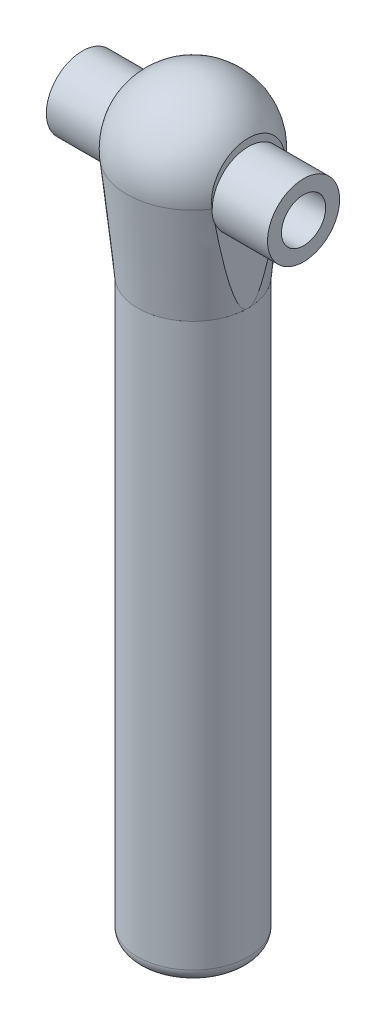
ISO-10303-21;
HEADER;
FILE_DESCRIPTION(('STEP AP214'),'2;1');
FILE_NAME('part.step','',(''),(''),'','','');
FILE_SCHEMA(('AUTOMOTIVE_DESIGN { 1 0 10303 214 1 1 1 1 }'));
ENDSEC;
DATA;
#1=APPLICATION_CONTEXT('core data for automotive mechanical design processes');
#2=APPLICATION_PROTOCOL_DEFINITION('international standard','automotive_design',2000,#1);
#3=PRODUCT_CONTEXT('',#1,'mechanical');
#4=PRODUCT('Part','Part','',(#3));
#5=PRODUCT_RELATED_PRODUCT_CATEGORY('part','',(#4));
#6=PRODUCT_DEFINITION_FORMATION('','',#4);
#7=PRODUCT_DEFINITION_CONTEXT('part definition',#1,'design');
#8=PRODUCT_DEFINITION('design','',#6,#7);
#9=PRODUCT_DEFINITION_SHAPE('','',#8);
#10=(LENGTH_UNIT() NAMED_UNIT(*) SI_UNIT(.MILLI.,.METRE.));
#11=(NAMED_UNIT(*) PLANE_ANGLE_UNIT() SI_UNIT($,.RADIAN.));
#12=(NAMED_UNIT(*) SI_UNIT($,.STERADIAN.) SOLID_ANGLE_UNIT());
#13=UNCERTAINTY_MEASURE_WITH_UNIT(LENGTH_MEASURE(1.E-05),#10,'distance_accuracy_value','');
#14=(GEOMETRIC_REPRESENTATION_CONTEXT(3) GLOBAL_UNCERTAINTY_ASSIGNED_CONTEXT((#13)) GLOBAL_UNIT_ASSIGNED_CONTEXT((#10,
#11,#12)) REPRESENTATION_CONTEXT('',''));
#15=CARTESIAN_POINT('',(0.,0.,0.));
#16=DIRECTION('',(0.,0.,1.));
#17=DIRECTION('',(1.,0.,0.));
#18=AXIS2_PLACEMENT_3D('',#15,#16,#17);
#19=CARTESIAN_POINT('',(12.5,170.,15.));
#20=DIRECTION('',(-1.,0.,0.));
#21=DIRECTION('',(0.,0.,1.));
#22=AXIS2_PLACEMENT_3D('',#19,#20,#21);
#23=PLANE('',#22);
#24=CARTESIAN_POINT('',(12.5,155.,0.));
#25=DIRECTION('',(-1.,0.,0.));
#26=DIRECTION('',(0.,0.,1.));
#27=AXIS2_PLACEMENT_3D('',#24,#25,#26);
#28=CIRCLE('',#27,8.29156197588853);
#29=CARTESIAN_POINT('',(12.5,153.460388679234,-8.14736748778213));
#30=VERTEX_POINT('',#29);
#31=CARTESIAN_POINT('',(12.5,153.460388679234,8.14736748778213));
#32=VERTEX_POINT('',#31);
#33=EDGE_CURVE('E156',#30,#32,#28,.F.);
#34=ORIENTED_EDGE('',*,*,#33,.T.);
#35=CARTESIAN_POINT('',(12.5,153.460388679234,0.));
#36=DIRECTION('',(-1.,0.,0.));
#37=DIRECTION('',(0.,0.,1.));
#38=AXIS2_PLACEMENT_3D('',#35,#36,#37);
#39=CIRCLE('',#38,8.14736748778213);
#40=EDGE_CURVE('E157',#32,#30,#39,.T.);
#41=ORIENTED_EDGE('',*,*,#40,.T.);
#42=EDGE_LOOP('',(#34,#41));
#43=FACE_BOUND('',#42,.T.);
#44=ADVANCED_FACE('F51',(#43),#23,.F.);
#45=CARTESIAN_POINT('',(-12.5,170.,15.));
#46=DIRECTION('',(1.,0.,0.));
#47=DIRECTION('',(0.,0.,-1.));
#48=AXIS2_PLACEMENT_3D('',#45,#46,#47);
#49=PLANE('',#48);
#50=CARTESIAN_POINT('',(-12.5,155.,0.));
#51=DIRECTION('',(1.,0.,0.));
#52=DIRECTION('',(0.,0.,-1.));
#53=AXIS2_PLACEMENT_3D('',#50,#51,#52);
#54=CIRCLE('',#53,8.29156197588853);
#55=CARTESIAN_POINT('',(-12.5,153.460388679234,8.14736748778213));
#56=VERTEX_POINT('',#55);
#57=CARTESIAN_POINT('',(-12.5,153.460388679234,-8.14736748778213));
#58=VERTEX_POINT('',#57);
#59=EDGE_CURVE('E161',#56,#58,#54,.F.);
#60=ORIENTED_EDGE('',*,*,#59,.T.);
#61=CARTESIAN_POINT('',(-12.5,153.460388679234,0.));
#62=DIRECTION('',(1.,0.,0.));
#63=DIRECTION('',(0.,0.,-1.));
#64=AXIS2_PLACEMENT_3D('',#61,#62,#63);
#65=CIRCLE('',#64,8.14736748778213);
#66=EDGE_CURVE('E12',#58,#56,#65,.T.);
#67=ORIENTED_EDGE('',*,*,#66,.T.);
#68=EDGE_LOOP('',(#60,#67));
#69=FACE_BOUND('',#68,.T.);
#70=ADVANCED_FACE('F135',(#69),#49,.F.);
#71=CARTESIAN_POINT('',(0.,130.,0.));
#72=DIRECTION('',(0.,1.,0.));
#73=DIRECTION('',(0.,0.,1.));
#74=AXIS2_PLACEMENT_3D('',#71,#72,#73);
#75=CONICAL_SURFACE('',#74,12.5,0.10282183670153);
#76=CARTESIAN_POINT('',(0.,153.460388679234,0.));
#77=DIRECTION('',(0.,1.,0.));
#78=DIRECTION('',(0.,0.,1.));
#79=AXIS2_PLACEMENT_3D('',#76,#77,#78);
#80=CIRCLE('',#79,14.9207773584679);
#81=EDGE_CURVE('E108',#56,#32,#80,.T.);
#82=ORIENTED_EDGE('',*,*,#81,.F.);
#83=CARTESIAN_POINT('',(-12.8971128059561,155.444131179417,7.90217455349705));
#84=CARTESIAN_POINT('',(-12.8532976993089,155.284756480767,7.94219202890737));
#85=CARTESIAN_POINT('',(-12.811769371085,155.123547450824,7.97752755589714));
#86=CARTESIAN_POINT('',(-12.73389247646,154.798021652102,8.03851555139952));
#87=CARTESIAN_POINT('',(-12.6975456348444,154.633703869018,8.06416480025946));
#88=CARTESIAN_POINT('',(-12.630574945706,154.302168273729,8.10549138551638));
#89=CARTESIAN_POINT('',(-12.5999672780091,154.134943673045,8.12114082054811));
#90=CARTESIAN_POINT('',(-12.5451212778283,153.798818876321,8.14207684777293));
#91=CARTESIAN_POINT('',(-12.5208825520526,153.629918784414,8.14736407997798));
#92=CARTESIAN_POINT('',(-12.4760668157002,153.266092738545,8.14737139677965));
#93=CARTESIAN_POINT('',(-12.4565693915909,153.071029469372,8.14040420835782));
#94=CARTESIAN_POINT('',(-12.4268283517072,152.681167967036,8.11237428924915));
#95=CARTESIAN_POINT('',(-12.4165867710369,152.486369801557,8.09130846043236));
#96=CARTESIAN_POINT('',(-12.4053744426827,152.099026556307,8.03520336730302));
#97=CARTESIAN_POINT('',(-12.4043807085105,151.906477078909,8.00019897494792));
#98=CARTESIAN_POINT('',(-12.4112699477363,151.52462811659,7.91647706410705));
#99=CARTESIAN_POINT('',(-12.4191489268737,151.335327208183,7.86776572352884));
#100=CARTESIAN_POINT('',(-12.4391519137908,151.023330661649,7.77543188887209));
#101=CARTESIAN_POINT('',(-12.4489991749449,150.89938099755,7.73548602125756));
#102=CARTESIAN_POINT('',(-12.47210814997,150.653845211785,7.64982458935827));
#103=CARTESIAN_POINT('',(-12.4853692630835,150.532258678309,7.60411004094644));
#104=CARTESIAN_POINT('',(-12.5263754528188,150.199703165639,7.46993280624241));
#105=CARTESIAN_POINT('',(-12.5574403388809,149.991506895738,7.37551962820136));
#106=CARTESIAN_POINT('',(-12.6275865101273,149.584739887028,7.17014153344888));
#107=CARTESIAN_POINT('',(-12.6666735506994,149.386176186137,7.05916474907889));
#108=CARTESIAN_POINT('',(-12.7510956333686,148.999287394967,6.82128218450927));
#109=CARTESIAN_POINT('',(-12.7964510651342,148.810998634432,6.6943245475887));
#110=CARTESIAN_POINT('',(-12.8913853980119,148.446311093265,6.42572809414165));
#111=CARTESIAN_POINT('',(-12.9409659185186,148.269916918418,6.28408364389459));
#112=CARTESIAN_POINT('',(-13.0751619933712,147.82033698982,5.8912659953042));
#113=CARTESIAN_POINT('',(-13.1617978391496,147.55788145129,5.62824934872198));
#114=CARTESIAN_POINT('',(-13.2902647410835,147.19358404562,5.20968338206092));
#115=CARTESIAN_POINT('',(-13.3327278660564,147.077320716754,5.0665682562876));
#116=CARTESIAN_POINT('',(-13.4163970094995,146.854593119621,4.77252785634636));
#117=CARTESIAN_POINT('',(-13.4576028646326,146.748130120963,4.62160157420809));
#118=CARTESIAN_POINT('',(-13.4977536066289,146.646742234709,4.46696979058302));
#119=B_SPLINE_CURVE_WITH_KNOTS('',3,(#83,#84,#85,#86,#87,#88,#89,#90,#91,#92,#93,#94,#95,#96,
#97,#98,#99,#100,#101,#102,#103,#104,#105,#106,#107,#108,#109,#110,#111,#112,#113,#114,#115,
#116,#117,#118),.UNSPECIFIED.,.F.,.F.,(4,2,2,2,2,2,2,2,2,2,2,2,2,2,2,2,2,4),(0.,
0.510141878539258,1.02045317581565,1.5321821910292,2.04387959877332,2.63162546098291,
3.21950052084173,3.8059139643774,4.39206352559995,4.78367672193357,5.17522105061486,
5.8662757270998,6.55782793561031,7.25168500598071,7.94580922487046,9.08645381551305,
9.65375599600966,10.221131565959),.UNSPECIFIED.);
#120=CARTESIAN_POINT('',(-12.5,150.413606031683,7.55623666116617));
#121=VERTEX_POINT('',#120);
#122=EDGE_CURVE('E97',#56,#121,#119,.T.);
#123=ORIENTED_EDGE('',*,*,#122,.T.);
#124=CARTESIAN_POINT('',(-12.5,191.41988562879,14.0928093796293));
#125=CARTESIAN_POINT('',(-12.5,190.007389890005,13.8979698618865));
#126=CARTESIAN_POINT('',(-12.5,188.595128519994,13.7014191869882));
#127=CARTESIAN_POINT('',(-12.5,185.771157283329,13.3043451226791));
#128=CARTESIAN_POINT('',(-12.5,184.359447419529,13.1038217129749));
#129=CARTESIAN_POINT('',(-12.5,181.536396287306,12.6982135132682));
#130=CARTESIAN_POINT('',(-12.5,180.12505514764,12.4931278258921));
#131=CARTESIAN_POINT('',(-12.5,177.303144490784,12.0777254584575));
#132=CARTESIAN_POINT('',(-12.5,175.892574972247,11.8674087875622));
#133=CARTESIAN_POINT('',(-12.5,173.076559285859,11.4413019417788));
#134=CARTESIAN_POINT('',(-12.5,171.671110372926,11.225529937595));
#135=CARTESIAN_POINT('',(-12.5,168.861335059801,10.7868013079885));
#136=CARTESIAN_POINT('',(-12.5,167.457008657467,10.5638446963158));
#137=CARTESIAN_POINT('',(-12.5,164.649905082774,10.1093227316138));
#138=CARTESIAN_POINT('',(-12.5,163.24712775627,9.87775833328004));
#139=CARTESIAN_POINT('',(-12.5,160.443367875858,9.40404784412823));
#140=CARTESIAN_POINT('',(-12.5,159.042385308225,9.16190183472984));
#141=CARTESIAN_POINT('',(-12.5,156.24202286729,8.66420633700024));
#142=CARTESIAN_POINT('',(-12.5,154.842644231345,8.40864983674422));
#143=CARTESIAN_POINT('',(-12.5,152.745908217305,8.01231278651157));
#144=CARTESIAN_POINT('',(-12.5,152.047323477552,7.87802099266218));
#145=CARTESIAN_POINT('',(-12.5,150.651142785268,7.60439920271956));
#146=CARTESIAN_POINT('',(-12.5,149.953546827519,7.46506923332402));
#147=CARTESIAN_POINT('',(-12.5,148.557486802977,7.18008213292745));
#148=CARTESIAN_POINT('',(-12.5,147.859026313502,7.03440743561615));
#149=CARTESIAN_POINT('',(-12.5,146.463624755377,6.73597303804361));
#150=CARTESIAN_POINT('',(-12.5,145.766683669069,6.5832134205816));
#151=CARTESIAN_POINT('',(-12.5,144.375013963069,6.26913875840751));
#152=CARTESIAN_POINT('',(-12.5,143.680284574083,6.1078271383986));
#153=CARTESIAN_POINT('',(-12.5,142.293426107252,5.77446388083123));
#154=CARTESIAN_POINT('',(-12.5,141.601296931447,5.6024126522617));
#155=CARTESIAN_POINT('',(-12.5,140.21827213756,5.24390099237299));
#156=CARTESIAN_POINT('',(-12.5,139.527388335694,5.05739441024336));
#157=CARTESIAN_POINT('',(-12.5,138.494756152031,4.7634053076002));
#158=CARTESIAN_POINT('',(-12.5,138.150996798182,4.66298574858849));
#159=CARTESIAN_POINT('',(-12.5,137.465188977526,4.456492455788));
#160=CARTESIAN_POINT('',(-12.5,137.123140436881,4.35041896836576));
#161=CARTESIAN_POINT('',(-12.5,136.442275511826,4.13174991242631));
#162=CARTESIAN_POINT('',(-12.5,136.103452453097,4.01917521143061));
#163=CARTESIAN_POINT('',(-12.5,135.428742156675,3.78556031249038));
#164=CARTESIAN_POINT('',(-12.5,135.09285470439,3.66452073924293));
#165=CARTESIAN_POINT('',(-12.5,134.425670953151,3.41174036555002));
#166=CARTESIAN_POINT('',(-12.5,134.094368651637,3.28001549424377));
#167=CARTESIAN_POINT('',(-12.5,133.437920871125,3.00212731813082));
#168=CARTESIAN_POINT('',(-12.5,133.112772573138,2.8559708246667));
#169=CARTESIAN_POINT('',(-12.5,132.631816927456,2.62082548058945));
#170=CARTESIAN_POINT('',(-12.5,132.472237428326,2.53956964937583));
#171=CARTESIAN_POINT('',(-12.5,132.156446630354,2.37050394950973));
#172=CARTESIAN_POINT('',(-12.5,132.000237173263,2.28269060850811));
#173=CARTESIAN_POINT('',(-12.5,131.692573780173,2.09880063653451));
#174=CARTESIAN_POINT('',(-12.5,131.54112306518,2.0027185665348));
#175=CARTESIAN_POINT('',(-12.5,131.245587196824,1.7999280184929));
#176=CARTESIAN_POINT('',(-12.5,131.101494472482,1.69323081043086));
#177=CARTESIAN_POINT('',(-12.5,130.823339890126,1.46433533138545));
#178=CARTESIAN_POINT('',(-12.5,130.689406140449,1.34197912683608));
#179=CARTESIAN_POINT('',(-12.5,130.442716774831,1.07764770934364));
#180=CARTESIAN_POINT('',(-12.5,130.329822705351,0.935812262252842));
#181=CARTESIAN_POINT('',(-12.5,130.194096011985,0.711326523015938));
#182=CARTESIAN_POINT('',(-12.5,130.155616438178,0.638270287037325));
#183=CARTESIAN_POINT('',(-12.5,130.089792972909,0.487242362308563));
#184=CARTESIAN_POINT('',(-12.5,130.062439516739,0.409274962385271));
#185=CARTESIAN_POINT('',(-12.5,130.021484702966,0.248801196290968));
#186=CARTESIAN_POINT('',(-12.5,130.008033042449,0.166255306340109));
#187=CARTESIAN_POINT('',(-12.5,129.997332225669,0.000121635418316699));
#188=CARTESIAN_POINT('',(-12.5,130.000073193944,-0.083465479499697));
#189=CARTESIAN_POINT('',(-12.5,130.020128179634,-0.239495032837292));
#190=CARTESIAN_POINT('',(-12.5,130.035817907575,-0.3121576170559));
#191=CARTESIAN_POINT('',(-12.5,130.078003812939,-0.454247515189188));
#192=CARTESIAN_POINT('',(-12.5,130.104508230407,-0.523672317093025));
#193=CARTESIAN_POINT('',(-12.5,130.18468307797,-0.698845501695901));
#194=CARTESIAN_POINT('',(-12.5,130.245118563872,-0.801466855690371));
#195=CARTESIAN_POINT('',(-12.5,130.380648537201,-0.996499074099693));
#196=CARTESIAN_POINT('',(-12.5,130.455789704793,-1.08887591686963));
#197=CARTESIAN_POINT('',(-12.5,130.636015681202,-1.28728330089285));
#198=CARTESIAN_POINT('',(-12.5,130.743847604067,-1.39077892483156));
#199=CARTESIAN_POINT('',(-12.5,130.96891781461,-1.58712000862766));
#200=CARTESIAN_POINT('',(-12.5,131.086173988613,-1.67994436377089));
#201=CARTESIAN_POINT('',(-12.5,131.327478386487,-1.85767524598175));
#202=CARTESIAN_POINT('',(-12.5,131.451560634086,-1.94253506822734));
#203=CARTESIAN_POINT('',(-12.5,131.703912012093,-2.10542773582022));
#204=CARTESIAN_POINT('',(-12.5,131.832177088996,-2.18346693590289));
#205=CARTESIAN_POINT('',(-12.5,132.213477097929,-2.40477077191927));
#206=CARTESIAN_POINT('',(-12.5,132.470797084058,-2.5406275556516));
#207=CARTESIAN_POINT('',(-12.5,132.992430702121,-2.79829984280627));
#208=CARTESIAN_POINT('',(-12.5,133.256749276505,-2.92010507916519));
#209=CARTESIAN_POINT('',(-12.5,133.790570075184,-3.15343876604214));
#210=CARTESIAN_POINT('',(-12.5,134.06008268776,-3.26494330571197));
#211=CARTESIAN_POINT('',(-12.5,134.602360315166,-3.47975658322876));
#212=CARTESIAN_POINT('',(-12.5,134.875125685206,-3.58306441637092));
#213=CARTESIAN_POINT('',(-12.5,135.42352370356,-3.78327515659855));
#214=CARTESIAN_POINT('',(-12.5,135.699160515459,-3.88016660511753));
#215=CARTESIAN_POINT('',(-12.5,136.252292314313,-4.06853140319062));
#216=CARTESIAN_POINT('',(-12.5,136.529787427041,-4.1600043818005));
#217=CARTESIAN_POINT('',(-12.5,137.085804687615,-4.33826504469676));
#218=CARTESIAN_POINT('',(-12.5,137.364324606585,-4.42505970194713));
#219=CARTESIAN_POINT('',(-12.5,137.922529475745,-4.59477427182586));
#220=CARTESIAN_POINT('',(-12.5,138.202214390715,-4.67769430067802));
#221=CARTESIAN_POINT('',(-12.5,139.036413660791,-4.91963197320274));
#222=CARTESIAN_POINT('',(-12.5,139.592334321923,-5.07380481304442));
#223=CARTESIAN_POINT('',(-12.5,140.706877674334,-5.37209173831357));
#224=CARTESIAN_POINT('',(-12.5,141.265500521076,-5.5162052374623));
#225=CARTESIAN_POINT('',(-12.5,142.384869773969,-5.79637606514947));
#226=CARTESIAN_POINT('',(-12.5,142.945616563404,-5.93243185791832));
#227=CARTESIAN_POINT('',(-12.5,144.068686977119,-6.19788707016519));
#228=CARTESIAN_POINT('',(-12.5,144.631010628656,-6.32728637382525));
#229=CARTESIAN_POINT('',(-12.5,146.321213650886,-6.70747106652309));
#230=CARTESIAN_POINT('',(-12.5,147.450970553561,-6.94991037339827));
#231=CARTESIAN_POINT('',(-12.5,149.713706014729,-7.41843680466489));
#232=CARTESIAN_POINT('',(-12.5,150.846684212188,-7.64452569188175));
#233=CARTESIAN_POINT('',(-12.5,153.112606873497,-8.08358983876333));
#234=CARTESIAN_POINT('',(-12.5,154.245546020163,-8.29659262738472));
#235=CARTESIAN_POINT('',(-12.5,156.513286755815,-8.71257208111089));
#236=CARTESIAN_POINT('',(-12.5,157.648088393098,-8.9155484818283));
#237=CARTESIAN_POINT('',(-12.5,159.918481067632,-9.31318172123117));
#238=CARTESIAN_POINT('',(-12.5,161.054071291348,-9.5078432162104));
#239=CARTESIAN_POINT('',(-12.5,163.326405705193,-9.89031974033313));
#240=CARTESIAN_POINT('',(-12.5,164.463149899842,-10.0781347425492));
#241=CARTESIAN_POINT('',(-12.5,167.747347989097,-10.6121964801569));
#242=CARTESIAN_POINT('',(-12.5,169.896005669125,-10.951041733623));
#243=CARTESIAN_POINT('',(-12.5,174.19609444908,-11.6132528452771));
#244=CARTESIAN_POINT('',(-12.5,176.347525986807,-11.9366158419256));
#245=CARTESIAN_POINT('',(-12.5,180.651880543901,-12.5710749496353));
#246=CARTESIAN_POINT('',(-12.5,182.804803306861,-12.8821728032254));
#247=CARTESIAN_POINT('',(-12.5,186.03500929569,-13.3414035057081));
#248=CARTESIAN_POINT('',(-12.5,187.111769906666,-13.4932290349799));
#249=CARTESIAN_POINT('',(-12.5,189.265602510448,-13.794642029263));
#250=CARTESIAN_POINT('',(-12.5,190.342674502714,-13.9442294981417));
#251=CARTESIAN_POINT('',(-12.5,191.41988562879,-14.0928093796293));
#252=B_SPLINE_CURVE_WITH_KNOTS('',3,(#124,#125,#126,#127,#128,#129,#130,#131,#132,#133,#134,
#135,#136,#137,#138,#139,#140,#141,#142,#143,#144,#145,#146,#147,#148,#149,#150,#151,#152,#153,
#154,#155,#156,#157,#158,#159,#160,#161,#162,#163,#164,#165,#166,#167,#168,#169,#170,#171,#172,
#173,#174,#175,#176,#177,#178,#179,#180,#181,#182,#183,#184,#185,#186,#187,#188,#189,#190,#191,
#192,#193,#194,#195,#196,#197,#198,#199,#200,#201,#202,#203,#204,#205,#206,#207,#208,#209,#210,
#211,#212,#213,#214,#215,#216,#217,#218,#219,#220,#221,#222,#223,#224,#225,#226,#227,#228,#229,
#230,#231,#232,#233,#234,#235,#236,#237,#238,#239,#240,#241,#242,#243,#244,#245,#246,#247,#248,
#249,#250,#251),.UNSPECIFIED.,.F.,.F.,(4,2,2,2,2,2,2,2,2,2,2,2,2,2,2,2,2,2,2,2,2,2,2,2,2,2,2,2,
2,2,2,2,2,2,2,2,2,2,2,2,2,2,2,2,2,2,2,2,2,2,2,2,2,2,2,2,2,2,2,2,2,2,2,4),(0.,4.27761287425656,
8.5552476049287,12.8337312941431,17.1122074891822,21.3779389349277,25.6436622173426,
29.9089137888982,34.1741325474852,38.4416041183244,40.57571565616,42.7098158868257,
44.8502558139237,46.9906707326768,49.1302348898165,51.2697176170933,53.4163370860661,
54.4906792901132,55.5649747185527,56.6359952804093,57.7069368855151,58.7763103299844,
59.8451814493958,60.3822979538988,60.9197009184827,61.4574601196538,61.994654359735,
62.537771307661,63.077177230072,63.3241894277115,63.5709888271232,63.8204189598785,
64.0696969873908,64.2917501172128,64.5139727530523,64.8691888502152,65.2255513520595,
65.6728906524752,66.1210999719161,66.5717919264221,67.0220593950373,67.8942724215533,
68.7671187658195,69.6419428357274,70.5168633296939,71.3933063431609,72.2698092880544,
73.1449674838723,74.0200994114713,75.7506688962985,77.4813391581497,79.2123382248812,
80.9433673995287,84.4096094190891,87.875477165847,91.3337848302683,94.7921836387049,
98.2486196723698,101.705069298836,108.23061857107,114.757369321756,121.283189440141,
124.545423042593,127.807651007308),.UNSPECIFIED.);
#253=CARTESIAN_POINT('',(-12.5,130.,0.));
#254=VERTEX_POINT('',#253);
#255=EDGE_CURVE('E102',#121,#254,#252,.T.);
#256=ORIENTED_EDGE('',*,*,#255,.T.);
#257=CARTESIAN_POINT('',(0.,130.,0.));
#258=DIRECTION('',(0.,1.,0.));
#259=DIRECTION('',(0.,0.,1.));
#260=AXIS2_PLACEMENT_3D('',#257,#258,#259);
#261=CIRCLE('',#260,12.5);
#262=CARTESIAN_POINT('',(12.5,130.,0.));
#263=VERTEX_POINT('',#262);
#264=EDGE_CURVE('E167',#254,#263,#261,.T.);
#265=ORIENTED_EDGE('',*,*,#264,.T.);
#266=CARTESIAN_POINT('',(12.5,191.41988562879,-14.0928093796293));
#267=CARTESIAN_POINT('',(12.5,190.007389890005,-13.8979698618865));
#268=CARTESIAN_POINT('',(12.5,188.595128519994,-13.7014191869882));
#269=CARTESIAN_POINT('',(12.5,185.771157283329,-13.3043451226791));
#270=CARTESIAN_POINT('',(12.5,184.359447419529,-13.1038217129749));
#271=CARTESIAN_POINT('',(12.5,181.536396287306,-12.6982135132682));
#272=CARTESIAN_POINT('',(12.5,180.12505514764,-12.4931278258921));
#273=CARTESIAN_POINT('',(12.5,177.303144490784,-12.0777254584575));
#274=CARTESIAN_POINT('',(12.5,175.892574972247,-11.8674087875622));
#275=CARTESIAN_POINT('',(12.5,173.076559285859,-11.4413019417788));
#276=CARTESIAN_POINT('',(12.5,171.671110372926,-11.225529937595));
#277=CARTESIAN_POINT('',(12.5,168.861335059801,-10.7868013079885));
#278=CARTESIAN_POINT('',(12.5,167.457008657467,-10.5638446963158));
#279=CARTESIAN_POINT('',(12.5,164.649905082774,-10.1093227316138));
#280=CARTESIAN_POINT('',(12.5,163.24712775627,-9.87775833328004));
#281=CARTESIAN_POINT('',(12.5,160.443367875858,-9.40404784412823));
#282=CARTESIAN_POINT('',(12.5,159.042385308225,-9.16190183472984));
#283=CARTESIAN_POINT('',(12.5,156.24202286729,-8.66420633700024));
#284=CARTESIAN_POINT('',(12.5,154.842644231345,-8.40864983674422));
#285=CARTESIAN_POINT('',(12.5,152.745908217305,-8.01231278651157));
#286=CARTESIAN_POINT('',(12.5,152.047323477552,-7.87802099266218));
#287=CARTESIAN_POINT('',(12.5,150.651142785268,-7.60439920271956));
#288=CARTESIAN_POINT('',(12.5,149.953546827519,-7.46506923332402));
#289=CARTESIAN_POINT('',(12.5,148.557486802977,-7.18008213292745));
#290=CARTESIAN_POINT('',(12.5,147.859026313502,-7.03440743561615));
#291=CARTESIAN_POINT('',(12.5,146.463624755377,-6.73597303804361));
#292=CARTESIAN_POINT('',(12.5,145.766683669069,-6.5832134205816));
#293=CARTESIAN_POINT('',(12.5,144.375013963069,-6.26913875840751));
#294=CARTESIAN_POINT('',(12.5,143.680284574083,-6.1078271383986));
#295=CARTESIAN_POINT('',(12.5,142.293426107252,-5.77446388083123));
#296=CARTESIAN_POINT('',(12.5,141.601296931447,-5.6024126522617));
#297=CARTESIAN_POINT('',(12.5,140.21827213756,-5.24390099237299));
#298=CARTESIAN_POINT('',(12.5,139.527388335694,-5.05739441024336));
#299=CARTESIAN_POINT('',(12.5,138.494756152031,-4.7634053076002));
#300=CARTESIAN_POINT('',(12.5,138.150996798182,-4.66298574858849));
#301=CARTESIAN_POINT('',(12.5,137.465188977526,-4.456492455788));
#302=CARTESIAN_POINT('',(12.5,137.123140436881,-4.35041896836576));
#303=CARTESIAN_POINT('',(12.5,136.442275511826,-4.13174991242631));
#304=CARTESIAN_POINT('',(12.5,136.103452453097,-4.01917521143061));
#305=CARTESIAN_POINT('',(12.5,135.428742156675,-3.78556031249038));
#306=CARTESIAN_POINT('',(12.5,135.09285470439,-3.66452073924293));
#307=CARTESIAN_POINT('',(12.5,134.425670953151,-3.41174036555002));
#308=CARTESIAN_POINT('',(12.5,134.094368651637,-3.28001549424377));
#309=CARTESIAN_POINT('',(12.5,133.437920871125,-3.00212731813082));
#310=CARTESIAN_POINT('',(12.5,133.112772573138,-2.8559708246667));
#311=CARTESIAN_POINT('',(12.5,132.631816927456,-2.62082548058945));
#312=CARTESIAN_POINT('',(12.5,132.472237428326,-2.53956964937583));
#313=CARTESIAN_POINT('',(12.5,132.156446630354,-2.37050394950973));
#314=CARTESIAN_POINT('',(12.5,132.000237173263,-2.28269060850811));
#315=CARTESIAN_POINT('',(12.5,131.692573780173,-2.09880063653451));
#316=CARTESIAN_POINT('',(12.5,131.54112306518,-2.0027185665348));
#317=CARTESIAN_POINT('',(12.5,131.245587196824,-1.7999280184929));
#318=CARTESIAN_POINT('',(12.5,131.101494472482,-1.69323081043086));
#319=CARTESIAN_POINT('',(12.5,130.823339890126,-1.46433533138545));
#320=CARTESIAN_POINT('',(12.5,130.689406140449,-1.34197912683608));
#321=CARTESIAN_POINT('',(12.5,130.442716774831,-1.07764770934364));
#322=CARTESIAN_POINT('',(12.5,130.329822705351,-0.935812262252842));
#323=CARTESIAN_POINT('',(12.5,130.194096011985,-0.711326523015938));
#324=CARTESIAN_POINT('',(12.5,130.155616438178,-0.638270287037325));
#325=CARTESIAN_POINT('',(12.5,130.089792972909,-0.487242362308563));
#326=CARTESIAN_POINT('',(12.5,130.062439516739,-0.409274962385271));
#327=CARTESIAN_POINT('',(12.5,130.021484702966,-0.248801196290968));
#328=CARTESIAN_POINT('',(12.5,130.008033042449,-0.166255306340109));
#329=CARTESIAN_POINT('',(12.5,129.997332225669,-0.000121635418316699));
#330=CARTESIAN_POINT('',(12.5,130.000073193944,0.083465479499697));
#331=CARTESIAN_POINT('',(12.5,130.020128179634,0.239495032837292));
#332=CARTESIAN_POINT('',(12.5,130.035817907575,0.3121576170559));
#333=CARTESIAN_POINT('',(12.5,130.078003812939,0.454247515189188));
#334=CARTESIAN_POINT('',(12.5,130.104508230407,0.523672317093025));
#335=CARTESIAN_POINT('',(12.5,130.18468307797,0.698845501695901));
#336=CARTESIAN_POINT('',(12.5,130.245118563872,0.801466855690371));
#337=CARTESIAN_POINT('',(12.5,130.380648537201,0.996499074099693));
#338=CARTESIAN_POINT('',(12.5,130.455789704793,1.08887591686963));
#339=CARTESIAN_POINT('',(12.5,130.636015681202,1.28728330089285));
#340=CARTESIAN_POINT('',(12.5,130.743847604067,1.39077892483156));
#341=CARTESIAN_POINT('',(12.5,130.96891781461,1.58712000862766));
#342=CARTESIAN_POINT('',(12.5,131.086173988613,1.67994436377089));
#343=CARTESIAN_POINT('',(12.5,131.327478386487,1.85767524598175));
#344=CARTESIAN_POINT('',(12.5,131.451560634086,1.94253506822734));
#345=CARTESIAN_POINT('',(12.5,131.703912012093,2.10542773582022));
#346=CARTESIAN_POINT('',(12.5,131.832177088996,2.18346693590289));
#347=CARTESIAN_POINT('',(12.5,132.213477097929,2.40477077191927));
#348=CARTESIAN_POINT('',(12.5,132.470797084058,2.5406275556516));
#349=CARTESIAN_POINT('',(12.5,132.992430702121,2.79829984280627));
#350=CARTESIAN_POINT('',(12.5,133.256749276505,2.92010507916519));
#351=CARTESIAN_POINT('',(12.5,133.790570075184,3.15343876604214));
#352=CARTESIAN_POINT('',(12.5,134.06008268776,3.26494330571197));
#353=CARTESIAN_POINT('',(12.5,134.602360315166,3.47975658322876));
#354=CARTESIAN_POINT('',(12.5,134.875125685206,3.58306441637092));
#355=CARTESIAN_POINT('',(12.5,135.42352370356,3.78327515659855));
#356=CARTESIAN_POINT('',(12.5,135.699160515459,3.88016660511753));
#357=CARTESIAN_POINT('',(12.5,136.252292314313,4.06853140319062));
#358=CARTESIAN_POINT('',(12.5,136.529787427041,4.1600043818005));
#359=CARTESIAN_POINT('',(12.5,137.085804687615,4.33826504469676));
#360=CARTESIAN_POINT('',(12.5,137.364324606585,4.42505970194713));
#361=CARTESIAN_POINT('',(12.5,137.922529475745,4.59477427182586));
#362=CARTESIAN_POINT('',(12.5,138.202214390715,4.67769430067802));
#363=CARTESIAN_POINT('',(12.5,139.036413660791,4.91963197320274));
#364=CARTESIAN_POINT('',(12.5,139.592334321923,5.07380481304442));
#365=CARTESIAN_POINT('',(12.5,140.706877674334,5.37209173831357));
#366=CARTESIAN_POINT('',(12.5,141.265500521076,5.5162052374623));
#367=CARTESIAN_POINT('',(12.5,142.384869773969,5.79637606514947));
#368=CARTESIAN_POINT('',(12.5,142.945616563404,5.93243185791832));
#369=CARTESIAN_POINT('',(12.5,144.068686977119,6.19788707016519));
#370=CARTESIAN_POINT('',(12.5,144.631010628656,6.32728637382525));
#371=CARTESIAN_POINT('',(12.5,146.321213650886,6.70747106652309));
#372=CARTESIAN_POINT('',(12.5,147.450970553561,6.94991037339827));
#373=CARTESIAN_POINT('',(12.5,149.713706014729,7.41843680466489));
#374=CARTESIAN_POINT('',(12.5,150.846684212188,7.64452569188175));
#375=CARTESIAN_POINT('',(12.5,153.112606873497,8.08358983876333));
#376=CARTESIAN_POINT('',(12.5,154.245546020163,8.29659262738472));
#377=CARTESIAN_POINT('',(12.5,156.513286755815,8.71257208111089));
#378=CARTESIAN_POINT('',(12.5,157.648088393098,8.9155484818283));
#379=CARTESIAN_POINT('',(12.5,159.918481067632,9.31318172123117));
#380=CARTESIAN_POINT('',(12.5,161.054071291348,9.5078432162104));
#381=CARTESIAN_POINT('',(12.5,163.326405705193,9.89031974033313));
#382=CARTESIAN_POINT('',(12.5,164.463149899842,10.0781347425492));
#383=CARTESIAN_POINT('',(12.5,167.747347989097,10.6121964801569));
#384=CARTESIAN_POINT('',(12.5,169.896005669125,10.951041733623));
#385=CARTESIAN_POINT('',(12.5,174.19609444908,11.6132528452771));
#386=CARTESIAN_POINT('',(12.5,176.347525986807,11.9366158419256));
#387=CARTESIAN_POINT('',(12.5,180.651880543901,12.5710749496353));
#388=CARTESIAN_POINT('',(12.5,182.804803306861,12.8821728032254));
#389=CARTESIAN_POINT('',(12.5,186.03500929569,13.3414035057081));
#390=CARTESIAN_POINT('',(12.5,187.111769906666,13.4932290349799));
#391=CARTESIAN_POINT('',(12.5,189.265602510448,13.794642029263));
#392=CARTESIAN_POINT('',(12.5,190.342674502714,13.9442294981417));
#393=CARTESIAN_POINT('',(12.5,191.41988562879,14.0928093796293));
#394=B_SPLINE_CURVE_WITH_KNOTS('',3,(#266,#267,#268,#269,#270,#271,#272,#273,#274,#275,#276,
#277,#278,#279,#280,#281,#282,#283,#284,#285,#286,#287,#288,#289,#290,#291,#292,#293,#294,#295,
#296,#297,#298,#299,#300,#301,#302,#303,#304,#305,#306,#307,#308,#309,#310,#311,#312,#313,#314,
#315,#316,#317,#318,#319,#320,#321,#322,#323,#324,#325,#326,#327,#328,#329,#330,#331,#332,#333,
#334,#335,#336,#337,#338,#339,#340,#341,#342,#343,#344,#345,#346,#347,#348,#349,#350,#351,#352,
#353,#354,#355,#356,#357,#358,#359,#360,#361,#362,#363,#364,#365,#366,#367,#368,#369,#370,#371,
#372,#373,#374,#375,#376,#377,#378,#379,#380,#381,#382,#383,#384,#385,#386,#387,#388,#389,#390,
#391,#392,#393),.UNSPECIFIED.,.F.,.F.,(4,2,2,2,2,2,2,2,2,2,2,2,2,2,2,2,2,2,2,2,2,2,2,2,2,2,2,2,
2,2,2,2,2,2,2,2,2,2,2,2,2,2,2,2,2,2,2,2,2,2,2,2,2,2,2,2,2,2,2,2,2,2,2,4),(0.,4.27761287425656,
8.5552476049287,12.8337312941431,17.1122074891822,21.3779389349277,25.6436622173426,
29.9089137888982,34.1741325474853,38.4416041183244,40.57571565616,42.7098158868257,
44.8502558139237,46.9906707326768,49.1302348898165,51.2697176170934,53.4163370860661,
54.4906792901133,55.5649747185527,56.6359952804093,57.7069368855151,58.7763103299844,
59.8451814493958,60.3822979538988,60.9197009184827,61.4574601196539,61.994654359735,
62.537771307661,63.077177230072,63.3241894277115,63.5709888271232,63.8204189598785,
64.0696969873908,64.2917501172128,64.5139727530523,64.8691888502152,65.2255513520595,
65.6728906524752,66.1210999719161,66.5717919264221,67.0220593950373,67.8942724215533,
68.7671187658195,69.6419428357274,70.5168633296939,71.3933063431609,72.2698092880544,
73.1449674838723,74.0200994114713,75.7506688962985,77.4813391581497,79.2123382248812,
80.9433673995287,84.4096094190891,87.875477165847,91.3337848302683,94.7921836387049,
98.2486196723698,101.705069298836,108.23061857107,114.757369321756,121.283189440141,
124.545423042593,127.807651007308),.UNSPECIFIED.);
#395=CARTESIAN_POINT('',(12.5,150.413606031668,7.55623666116311));
#396=VERTEX_POINT('',#395);
#397=EDGE_CURVE('E122',#263,#396,#394,.T.);
#398=ORIENTED_EDGE('',*,*,#397,.T.);
#399=CARTESIAN_POINT('',(13.4977536066289,146.646742234709,4.46696979058302));
#400=CARTESIAN_POINT('',(13.4473513378521,146.77404481966,4.66114906131095));
#401=CARTESIAN_POINT('',(13.3952391252709,146.909428683367,4.84955255600701));
#402=CARTESIAN_POINT('',(13.28936768276,147.195540982223,5.21391906719938));
#403=CARTESIAN_POINT('',(13.2356080146444,147.346273524976,5.38987873202355));
#404=CARTESIAN_POINT('',(13.1282038518432,147.662312620564,5.72848843461279));
#405=CARTESIAN_POINT('',(13.07455947154,147.827629854629,5.89112854675162));
#406=CARTESIAN_POINT('',(12.9693814776994,148.171826078772,6.20197387775286));
#407=CARTESIAN_POINT('',(12.9178473339891,148.350701629876,6.35018273535806));
#408=CARTESIAN_POINT('',(12.7922007549883,148.821100503269,6.70705793099499));
#409=CARTESIAN_POINT('',(12.7208756722807,149.121409600784,6.90529733618149));
#410=CARTESIAN_POINT('',(12.5956555843632,149.748401916203,7.26157730782243));
#411=CARTESIAN_POINT('',(12.5417515157382,150.075071309051,7.41963876799072));
#412=CARTESIAN_POINT('',(12.4779316820096,150.592541102612,7.62843689835768));
#413=CARTESIAN_POINT('',(12.4592111532333,150.776040837074,7.69493914958879));
#414=CARTESIAN_POINT('',(12.4297714924625,151.147904923411,7.81473724743312));
#415=CARTESIAN_POINT('',(12.4190495350241,151.336267533157,7.86803775302961));
#416=CARTESIAN_POINT('',(12.4063419590935,151.7163854231,7.96092309583333));
#417=CARTESIAN_POINT('',(12.4043456494712,151.90813626231,8.00052466286769));
#418=CARTESIAN_POINT('',(12.4095006763277,152.293801319165,8.06578475209951));
#419=CARTESIAN_POINT('',(12.416647506786,152.487714424503,8.09145013360039));
#420=CARTESIAN_POINT('',(12.4362735055254,152.811737297866,8.12255231064468));
#421=CARTESIAN_POINT('',(12.4461933849636,152.941648156393,8.1318764349193));
#422=CARTESIAN_POINT('',(12.4700926265064,153.201314618321,8.14428381276629));
#423=CARTESIAN_POINT('',(12.4840694407783,153.331070267998,8.14737097361427));
#424=CARTESIAN_POINT('',(12.520807044667,153.629292646909,8.14736294166565));
#425=CARTESIAN_POINT('',(12.5449460367274,153.797594108326,8.14211470471513));
#426=CARTESIAN_POINT('',(12.5995608108569,154.132601933708,8.1213247181839));
#427=CARTESIAN_POINT('',(12.6300399401039,154.299307406271,8.10577752191667));
#428=CARTESIAN_POINT('',(12.696946999304,154.63094910005,8.0645775102013));
#429=CARTESIAN_POINT('',(12.7333981840361,154.795875605652,8.03888461333158));
#430=CARTESIAN_POINT('',(12.8115060841787,155.122526314033,7.977751577796));
#431=CARTESIAN_POINT('',(12.853158752439,155.28425289448,7.9423189918795));
#432=CARTESIAN_POINT('',(12.8971128059561,155.444131179417,7.90217455349705));
#433=B_SPLINE_CURVE_WITH_KNOTS('',3,(#399,#400,#401,#402,#403,#404,#405,#406,#407,#408,#409,
#410,#411,#412,#413,#414,#415,#416,#417,#418,#419,#420,#421,#422,#423,#424,#425,#426,#427,#428,
#429,#430,#431,#432),.UNSPECIFIED.,.F.,.F.,(4,2,2,2,2,2,2,2,2,2,2,2,2,2,2,2,4),(0.,
0.712535680451438,1.42526255295431,2.13851580058702,2.85158873800976,3.94868990639044,
5.04521937727423,5.63287223444927,6.22031740860931,6.80704261141742,7.39347876937865,
7.78514827405034,8.17657233302423,8.68642101910838,9.19653955822127,9.70869385431527,
10.2204521097021),.UNSPECIFIED.);
#434=EDGE_CURVE('E66',#396,#32,#433,.T.);
#435=ORIENTED_EDGE('',*,*,#434,.T.);
#436=EDGE_LOOP('',(#82,#123,#256,#265,#398,#435));
#437=FACE_BOUND('',#436,.T.);
#438=ADVANCED_FACE('F105',(#437),#75,.T.);
#439=CARTESIAN_POINT('',(0.,155.,0.));
#440=DIRECTION('',(0.,1.,0.));
#441=DIRECTION('',(0.,0.,1.));
#442=AXIS2_PLACEMENT_3D('',#439,#440,#441);
#443=SPHERICAL_SURFACE('',#442,15.);
#444=ORIENTED_EDGE('',*,*,#59,.F.);
#445=ORIENTED_EDGE('',*,*,#81,.T.);
#446=ORIENTED_EDGE('',*,*,#33,.F.);
#447=EDGE_CURVE('E165',#30,#58,#80,.T.);
#448=ORIENTED_EDGE('',*,*,#447,.T.);
#449=EDGE_LOOP('',(#444,#445,#446,#448));
#450=FACE_BOUND('',#449,.T.);
#451=ADVANCED_FACE('F53',(#450),#443,.T.);
#452=CARTESIAN_POINT('',(0.,130.,0.));
#453=DIRECTION('',(0.,-1.,0.));
#454=DIRECTION('',(0.,0.,-1.));
#455=AXIS2_PLACEMENT_3D('',#452,#453,#454);
#456=PLANE('',#455);
#457=EDGE_CURVE('E169',#263,#254,#261,.T.);
#458=ORIENTED_EDGE('',*,*,#457,.F.);
#459=ORIENTED_EDGE('',*,*,#264,.F.);
#460=EDGE_LOOP('',(#458,#459));
#461=FACE_BOUND('',#460,.T.);
#462=ADVANCED_FACE('F146',(#461),#456,.T.);
#463=ORIENTED_EDGE('',*,*,#447,.F.);
#464=CARTESIAN_POINT('',(12.8971128059561,155.444131179417,-7.90217455349705));
#465=CARTESIAN_POINT('',(12.8532976993089,155.284756480767,-7.94219202890737));
#466=CARTESIAN_POINT('',(12.811769371085,155.123547450824,-7.97752755589714));
#467=CARTESIAN_POINT('',(12.73389247646,154.798021652102,-8.03851555139952));
#468=CARTESIAN_POINT('',(12.6975456348444,154.633703869018,-8.06416480025946));
#469=CARTESIAN_POINT('',(12.630574945706,154.302168273729,-8.10549138551638));
#470=CARTESIAN_POINT('',(12.5999672780091,154.134943673045,-8.12114082054811));
#471=CARTESIAN_POINT('',(12.5451212778283,153.798818876321,-8.14207684777293));
#472=CARTESIAN_POINT('',(12.5208825520526,153.629918784414,-8.14736407997798));
#473=CARTESIAN_POINT('',(12.4760668157002,153.266092738545,-8.14737139677965));
#474=CARTESIAN_POINT('',(12.4565693915909,153.071029469372,-8.14040420835782));
#475=CARTESIAN_POINT('',(12.4268283517072,152.681167967036,-8.11237428924915));
#476=CARTESIAN_POINT('',(12.4165867710369,152.486369801557,-8.09130846043236));
#477=CARTESIAN_POINT('',(12.4053744426827,152.099026556307,-8.03520336730302));
#478=CARTESIAN_POINT('',(12.4043807085105,151.906477078909,-8.00019897494792));
#479=CARTESIAN_POINT('',(12.4112699477363,151.52462811659,-7.91647706410705));
#480=CARTESIAN_POINT('',(12.4191489268737,151.335327208183,-7.86776572352884));
#481=CARTESIAN_POINT('',(12.4391519137908,151.023330661649,-7.77543188887209));
#482=CARTESIAN_POINT('',(12.4489991749449,150.89938099755,-7.73548602125756));
#483=CARTESIAN_POINT('',(12.47210814997,150.653845211785,-7.64982458935827));
#484=CARTESIAN_POINT('',(12.4853692630835,150.532258678309,-7.60411004094644));
#485=CARTESIAN_POINT('',(12.5263754528188,150.199703165639,-7.46993280624241));
#486=CARTESIAN_POINT('',(12.5574403388809,149.991506895738,-7.37551962820136));
#487=CARTESIAN_POINT('',(12.6275865101273,149.584739887028,-7.17014153344888));
#488=CARTESIAN_POINT('',(12.6666735506994,149.386176186137,-7.05916474907889));
#489=CARTESIAN_POINT('',(12.7510956333686,148.999287394967,-6.82128218450927));
#490=CARTESIAN_POINT('',(12.7964510651342,148.810998634432,-6.6943245475887));
#491=CARTESIAN_POINT('',(12.8913853980119,148.446311093265,-6.42572809414165));
#492=CARTESIAN_POINT('',(12.9409659185186,148.269916918418,-6.28408364389459));
#493=CARTESIAN_POINT('',(13.0751619933712,147.82033698982,-5.8912659953042));
#494=CARTESIAN_POINT('',(13.1617978391496,147.55788145129,-5.62824934872198));
#495=CARTESIAN_POINT('',(13.2902647410835,147.19358404562,-5.20968338206092));
#496=CARTESIAN_POINT('',(13.3327278660564,147.077320716754,-5.0665682562876));
#497=CARTESIAN_POINT('',(13.4163970094995,146.854593119621,-4.77252785634636));
#498=CARTESIAN_POINT('',(13.4576028646326,146.748130120963,-4.62160157420809));
#499=CARTESIAN_POINT('',(13.4977536066289,146.646742234709,-4.46696979058302));
#500=B_SPLINE_CURVE_WITH_KNOTS('',3,(#464,#465,#466,#467,#468,#469,#470,#471,#472,#473,#474,
#475,#476,#477,#478,#479,#480,#481,#482,#483,#484,#485,#486,#487,#488,#489,#490,#491,#492,#493,
#494,#495,#496,#497,#498,#499),.UNSPECIFIED.,.F.,.F.,(4,2,2,2,2,2,2,2,2,2,2,2,2,2,2,2,2,4),(0.,
0.510141878539258,1.02045317581565,1.5321821910292,2.04387959877332,2.63162546098291,
3.21950052084173,3.8059139643774,4.39206352559995,4.78367672193357,5.17522105061486,
5.8662757270998,6.55782793561031,7.25168500598071,7.94580922487046,9.08645381551305,
9.65375599600966,10.221131565959),.UNSPECIFIED.);
#501=CARTESIAN_POINT('',(12.5,150.413606031683,-7.55623666116617));
#502=VERTEX_POINT('',#501);
#503=EDGE_CURVE('E273',#30,#502,#500,.T.);
#504=ORIENTED_EDGE('',*,*,#503,.T.);
#505=EDGE_CURVE('E114',#502,#263,#394,.T.);
#506=ORIENTED_EDGE('',*,*,#505,.T.);
#507=ORIENTED_EDGE('',*,*,#457,.T.);
#508=CARTESIAN_POINT('',(-12.5,150.413606031668,-7.55623666116311));
#509=VERTEX_POINT('',#508);
#510=EDGE_CURVE('E112',#254,#509,#252,.T.);
#511=ORIENTED_EDGE('',*,*,#510,.T.);
#512=CARTESIAN_POINT('',(-13.4977536066289,146.646742234709,-4.46696979058302));
#513=CARTESIAN_POINT('',(-13.4473513378521,146.77404481966,-4.66114906131095));
#514=CARTESIAN_POINT('',(-13.3952391252709,146.909428683367,-4.84955255600701));
#515=CARTESIAN_POINT('',(-13.28936768276,147.195540982223,-5.21391906719938));
#516=CARTESIAN_POINT('',(-13.2356080146444,147.346273524976,-5.38987873202355));
#517=CARTESIAN_POINT('',(-13.1282038518432,147.662312620564,-5.72848843461279));
#518=CARTESIAN_POINT('',(-13.07455947154,147.827629854629,-5.89112854675162));
#519=CARTESIAN_POINT('',(-12.9693814776994,148.171826078772,-6.20197387775286));
#520=CARTESIAN_POINT('',(-12.9178473339891,148.350701629876,-6.35018273535806));
#521=CARTESIAN_POINT('',(-12.7922007549883,148.821100503269,-6.70705793099499));
#522=CARTESIAN_POINT('',(-12.7208756722807,149.121409600784,-6.90529733618149));
#523=CARTESIAN_POINT('',(-12.5956555843632,149.748401916203,-7.26157730782243));
#524=CARTESIAN_POINT('',(-12.5417515157382,150.075071309051,-7.41963876799072));
#525=CARTESIAN_POINT('',(-12.4779316820096,150.592541102612,-7.62843689835768));
#526=CARTESIAN_POINT('',(-12.4592111532333,150.776040837074,-7.69493914958879));
#527=CARTESIAN_POINT('',(-12.4297714924625,151.147904923411,-7.81473724743312));
#528=CARTESIAN_POINT('',(-12.4190495350241,151.336267533157,-7.86803775302961));
#529=CARTESIAN_POINT('',(-12.4063419590935,151.7163854231,-7.96092309583333));
#530=CARTESIAN_POINT('',(-12.4043456494712,151.90813626231,-8.00052466286769));
#531=CARTESIAN_POINT('',(-12.4095006763277,152.293801319165,-8.06578475209951));
#532=CARTESIAN_POINT('',(-12.416647506786,152.487714424503,-8.09145013360039));
#533=CARTESIAN_POINT('',(-12.4362735055254,152.811737297866,-8.12255231064468));
#534=CARTESIAN_POINT('',(-12.4461933849636,152.941648156393,-8.1318764349193));
#535=CARTESIAN_POINT('',(-12.4700926265064,153.201314618321,-8.14428381276629));
#536=CARTESIAN_POINT('',(-12.4840694407783,153.331070267998,-8.14737097361427));
#537=CARTESIAN_POINT('',(-12.520807044667,153.629292646909,-8.14736294166565));
#538=CARTESIAN_POINT('',(-12.5449460367274,153.797594108326,-8.14211470471513));
#539=CARTESIAN_POINT('',(-12.5995608108569,154.132601933708,-8.1213247181839));
#540=CARTESIAN_POINT('',(-12.6300399401039,154.299307406271,-8.10577752191667));
#541=CARTESIAN_POINT('',(-12.696946999304,154.63094910005,-8.0645775102013));
#542=CARTESIAN_POINT('',(-12.7333981840361,154.795875605652,-8.03888461333158));
#543=CARTESIAN_POINT('',(-12.8115060841787,155.122526314033,-7.977751577796));
#544=CARTESIAN_POINT('',(-12.853158752439,155.28425289448,-7.9423189918795));
#545=CARTESIAN_POINT('',(-12.8971128059561,155.444131179417,-7.90217455349705));
#546=B_SPLINE_CURVE_WITH_KNOTS('',3,(#512,#513,#514,#515,#516,#517,#518,#519,#520,#521,#522,
#523,#524,#525,#526,#527,#528,#529,#530,#531,#532,#533,#534,#535,#536,#537,#538,#539,#540,#541,
#542,#543,#544,#545),.UNSPECIFIED.,.F.,.F.,(4,2,2,2,2,2,2,2,2,2,2,2,2,2,2,2,4),(0.,
0.712535680451438,1.42526255295431,2.13851580058702,2.85158873800976,3.94868990639044,
5.04521937727423,5.63287223444927,6.22031740860931,6.80704261141742,7.39347876937865,
7.78514827405034,8.17657233302423,8.68642101910838,9.19653955822127,9.70869385431527,
10.2204521097021),.UNSPECIFIED.);
#547=EDGE_CURVE('E74',#509,#58,#546,.T.);
#548=ORIENTED_EDGE('',*,*,#547,.T.);
#549=EDGE_LOOP('',(#463,#504,#506,#507,#511,#548));
#550=FACE_BOUND('',#549,.T.);
#551=ADVANCED_FACE('F129',(#550),#75,.T.);
#552=ORIENTED_EDGE('',*,*,#505,.F.);
#553=EDGE_CURVE('E109',#502,#396,#39,.T.);
#554=ORIENTED_EDGE('',*,*,#553,.T.);
#555=ORIENTED_EDGE('',*,*,#397,.F.);
#556=EDGE_LOOP('',(#552,#554,#555));
#557=FACE_BOUND('',#556,.T.);
#558=ADVANCED_FACE('F134',(#557),#23,.F.);
#559=ORIENTED_EDGE('',*,*,#255,.F.);
#560=EDGE_CURVE('E55',#121,#509,#65,.T.);
#561=ORIENTED_EDGE('',*,*,#560,.T.);
#562=ORIENTED_EDGE('',*,*,#510,.F.);
#563=EDGE_LOOP('',(#559,#561,#562));
#564=FACE_BOUND('',#563,.T.);
#565=ADVANCED_FACE('F111',(#564),#49,.F.);
#566=CARTESIAN_POINT('',(-25.,153.460388679234,0.));
#567=DIRECTION('',(1.,0.,0.));
#568=DIRECTION('',(0.,0.,-1.));
#569=AXIS2_PLACEMENT_3D('',#566,#567,#568);
#570=CYLINDRICAL_SURFACE('',#569,8.14736748778213);
#571=CARTESIAN_POINT('',(-25.,153.460388679234,0.));
#572=DIRECTION('',(1.,0.,0.));
#573=DIRECTION('',(0.,0.,-1.));
#574=AXIS2_PLACEMENT_3D('',#571,#572,#573);
#575=CIRCLE('',#574,8.14736748778213);
#576=CARTESIAN_POINT('',(-25.,153.460388679234,-8.14736748778213));
#577=VERTEX_POINT('',#576);
#578=EDGE_CURVE('E283',#577,#577,#575,.T.);
#579=ORIENTED_EDGE('',*,*,#578,.T.);
#580=EDGE_LOOP('',(#579));
#581=FACE_BOUND('',#580,.T.);
#582=ORIENTED_EDGE('',*,*,#66,.F.);
#583=ORIENTED_EDGE('',*,*,#547,.F.);
#584=ORIENTED_EDGE('',*,*,#560,.F.);
#585=ORIENTED_EDGE('',*,*,#122,.F.);
#586=EDGE_LOOP('',(#582,#583,#584,#585));
#587=FACE_BOUND('',#586,.T.);
#588=ADVANCED_FACE('F96',(#581,#587),#570,.T.);
#589=CARTESIAN_POINT('',(-25.,153.460388679234,0.));
#590=DIRECTION('',(1.,0.,0.));
#591=DIRECTION('',(0.,0.,-1.));
#592=AXIS2_PLACEMENT_3D('',#589,#590,#591);
#593=PLANE('',#592);
#594=CARTESIAN_POINT('',(-25.,153.460388679234,0.));
#595=DIRECTION('',(1.,0.,0.));
#596=DIRECTION('',(0.,0.,-1.));
#597=AXIS2_PLACEMENT_3D('',#594,#595,#596);
#598=CIRCLE('',#597,5.00000000000001);
#599=CARTESIAN_POINT('',(-25.,153.460388679234,-5.00000000000001));
#600=VERTEX_POINT('',#599);
#601=EDGE_CURVE('E285',#600,#600,#598,.T.);
#602=ORIENTED_EDGE('',*,*,#601,.T.);
#603=EDGE_LOOP('',(#602));
#604=FACE_BOUND('',#603,.T.);
#605=ORIENTED_EDGE('',*,*,#578,.F.);
#606=EDGE_LOOP('',(#605));
#607=FACE_BOUND('',#606,.T.);
#608=ADVANCED_FACE('F210',(#604,#607),#593,.F.);
#609=CARTESIAN_POINT('',(-12.5,153.460388679234,0.));
#610=DIRECTION('',(1.,0.,0.));
#611=DIRECTION('',(0.,0.,-1.));
#612=AXIS2_PLACEMENT_3D('',#609,#610,#611);
#613=CYLINDRICAL_SURFACE('',#612,5.);
#614=ORIENTED_EDGE('',*,*,#601,.F.);
#615=EDGE_LOOP('',(#614));
#616=FACE_BOUND('',#615,.T.);
#617=CARTESIAN_POINT('',(25.,153.460388679234,0.));
#618=DIRECTION('',(1.,0.,0.));
#619=DIRECTION('',(0.,0.,-1.));
#620=AXIS2_PLACEMENT_3D('',#617,#618,#619);
#621=CIRCLE('',#620,5.00000000000001);
#622=CARTESIAN_POINT('',(25.,153.460388679234,-5.00000000000001));
#623=VERTEX_POINT('',#622);
#624=EDGE_CURVE('E292',#623,#623,#621,.T.);
#625=ORIENTED_EDGE('',*,*,#624,.T.);
#626=EDGE_LOOP('',(#625));
#627=FACE_BOUND('',#626,.T.);
#628=ADVANCED_FACE('F136',(#616,#627),#613,.F.);
#629=CARTESIAN_POINT('',(25.,153.460388679234,0.));
#630=DIRECTION('',(1.,0.,0.));
#631=DIRECTION('',(0.,0.,-1.));
#632=AXIS2_PLACEMENT_3D('',#629,#630,#631);
#633=CIRCLE('',#632,8.14736748778213);
#634=CARTESIAN_POINT('',(25.,153.460388679234,-8.14736748778213));
#635=VERTEX_POINT('',#634);
#636=EDGE_CURVE('E288',#635,#635,#633,.T.);
#637=ORIENTED_EDGE('',*,*,#636,.F.);
#638=EDGE_LOOP('',(#637));
#639=FACE_BOUND('',#638,.T.);
#640=ORIENTED_EDGE('',*,*,#40,.F.);
#641=ORIENTED_EDGE('',*,*,#434,.F.);
#642=ORIENTED_EDGE('',*,*,#553,.F.);
#643=ORIENTED_EDGE('',*,*,#503,.F.);
#644=EDGE_LOOP('',(#640,#641,#642,#643));
#645=FACE_BOUND('',#644,.T.);
#646=ADVANCED_FACE('F212',(#639,#645),#570,.T.);
#647=CARTESIAN_POINT('',(25.,153.460388679234,0.));
#648=DIRECTION('',(1.,0.,0.));
#649=DIRECTION('',(0.,0.,-1.));
#650=AXIS2_PLACEMENT_3D('',#647,#648,#649);
#651=PLANE('',#650);
#652=ORIENTED_EDGE('',*,*,#636,.T.);
#653=EDGE_LOOP('',(#652));
#654=FACE_BOUND('',#653,.T.);
#655=ORIENTED_EDGE('',*,*,#624,.F.);
#656=EDGE_LOOP('',(#655));
#657=FACE_BOUND('',#656,.T.);
#658=ADVANCED_FACE('F241',(#654,#657),#651,.T.);
#659=CLOSED_SHELL('',(#44,#70,#438,#451,#462,#551,#558,#565,#588,#608,#628,#646,#658));
#660=MANIFOLD_SOLID_BREP('B2',#659);
#661=CARTESIAN_POINT('',(0.,130.,0.));
#662=DIRECTION('',(0.,-1.,0.));
#663=DIRECTION('',(0.,0.,-1.));
#664=AXIS2_PLACEMENT_3D('',#661,#662,#663);
#665=CYLINDRICAL_SURFACE('',#664,12.5);
#666=CARTESIAN_POINT('',(0.,3.,0.));
#667=DIRECTION('',(0.,1.,0.));
#668=DIRECTION('',(0.,0.,1.));
#669=AXIS2_PLACEMENT_3D('',#666,#667,#668);
#670=CIRCLE('',#669,12.5);
#671=CARTESIAN_POINT('',(0.,3.,12.5));
#672=VERTEX_POINT('',#671);
#673=EDGE_CURVE('E356',#672,#672,#670,.T.);
#674=ORIENTED_EDGE('',*,*,#673,.T.);
#675=EDGE_LOOP('',(#674));
#676=FACE_BOUND('',#675,.T.);
#677=CARTESIAN_POINT('',(0.,130.,0.));
#678=DIRECTION('',(0.,1.,0.));
#679=DIRECTION('',(0.,0.,1.));
#680=AXIS2_PLACEMENT_3D('',#677,#678,#679);
#681=CIRCLE('',#680,12.5);
#682=CARTESIAN_POINT('',(0.,130.,12.5));
#683=VERTEX_POINT('',#682);
#684=EDGE_CURVE('E362',#683,#683,#681,.T.);
#685=ORIENTED_EDGE('',*,*,#684,.F.);
#686=EDGE_LOOP('',(#685));
#687=FACE_BOUND('',#686,.T.);
#688=ADVANCED_FACE('F338',(#676,#687),#665,.T.);
#689=CARTESIAN_POINT('',(0.,130.,0.));
#690=DIRECTION('',(0.,1.,0.));
#691=DIRECTION('',(0.,0.,1.));
#692=AXIS2_PLACEMENT_3D('',#689,#690,#691);
#693=PLANE('',#692);
#694=CARTESIAN_POINT('',(0.,130.,0.));
#695=DIRECTION('',(0.,-1.,0.));
#696=DIRECTION('',(0.,0.,-1.));
#697=AXIS2_PLACEMENT_3D('',#694,#695,#696);
#698=CIRCLE('',#697,5.);
#699=CARTESIAN_POINT('',(0.,130.,-5.));
#700=VERTEX_POINT('',#699);
#701=EDGE_CURVE('E366',#700,#700,#698,.T.);
#702=ORIENTED_EDGE('',*,*,#701,.T.);
#703=EDGE_LOOP('',(#702));
#704=FACE_BOUND('',#703,.T.);
#705=ORIENTED_EDGE('',*,*,#684,.T.);
#706=EDGE_LOOP('',(#705));
#707=FACE_BOUND('',#706,.T.);
#708=ADVANCED_FACE('F371',(#704,#707),#693,.T.);
#709=CARTESIAN_POINT('',(0.,0.,0.));
#710=DIRECTION('',(0.,1.,0.));
#711=DIRECTION('',(0.,0.,1.));
#712=AXIS2_PLACEMENT_3D('',#709,#710,#711);
#713=PLANE('',#712);
#714=CARTESIAN_POINT('',(0.,0.,0.));
#715=DIRECTION('',(0.,1.,0.));
#716=DIRECTION('',(0.,0.,1.));
#717=AXIS2_PLACEMENT_3D('',#714,#715,#716);
#718=CIRCLE('',#717,9.5);
#719=CARTESIAN_POINT('',(0.,0.,9.5));
#720=VERTEX_POINT('',#719);
#721=EDGE_CURVE('E346',#720,#720,#718,.F.);
#722=ORIENTED_EDGE('',*,*,#721,.T.);
#723=EDGE_LOOP('',(#722));
#724=FACE_BOUND('',#723,.T.);
#725=CARTESIAN_POINT('',(0.,0.,0.));
#726=DIRECTION('',(0.,1.,0.));
#727=DIRECTION('',(0.,0.,1.));
#728=AXIS2_PLACEMENT_3D('',#725,#726,#727);
#729=CIRCLE('',#728,8.);
#730=CARTESIAN_POINT('',(0.,0.,8.));
#731=VERTEX_POINT('',#730);
#732=EDGE_CURVE('E351',#731,#731,#729,.T.);
#733=ORIENTED_EDGE('',*,*,#732,.T.);
#734=EDGE_LOOP('',(#733));
#735=FACE_BOUND('',#734,.T.);
#736=ADVANCED_FACE('F377',(#724,#735),#713,.F.);
#737=CARTESIAN_POINT('',(0.,130.,0.));
#738=DIRECTION('',(0.,-1.,0.));
#739=DIRECTION('',(0.,0.,-1.));
#740=AXIS2_PLACEMENT_3D('',#737,#738,#739);
#741=CYLINDRICAL_SURFACE('',#740,5.);
#742=CARTESIAN_POINT('',(0.,3.,0.));
#743=DIRECTION('',(0.,1.,0.));
#744=DIRECTION('',(0.,0.,1.));
#745=AXIS2_PLACEMENT_3D('',#742,#743,#744);
#746=CIRCLE('',#745,5.);
#747=CARTESIAN_POINT('',(0.,3.,5.));
#748=VERTEX_POINT('',#747);
#749=EDGE_CURVE('E50',#748,#748,#746,.F.);
#750=ORIENTED_EDGE('',*,*,#749,.T.);
#751=EDGE_LOOP('',(#750));
#752=FACE_BOUND('',#751,.T.);
#753=ORIENTED_EDGE('',*,*,#701,.F.);
#754=EDGE_LOOP('',(#753));
#755=FACE_BOUND('',#754,.T.);
#756=ADVANCED_FACE('F374',(#752,#755),#741,.F.);
#757=CARTESIAN_POINT('',(0.,3.,0.));
#758=DIRECTION('',(0.,1.,0.));
#759=DIRECTION('',(0.,0.,1.));
#760=AXIS2_PLACEMENT_3D('',#757,#758,#759);
#761=TOROIDAL_SURFACE('',#760,9.5,3.);
#762=ORIENTED_EDGE('',*,*,#721,.F.);
#763=EDGE_LOOP('',(#762));
#764=FACE_BOUND('',#763,.T.);
#765=ORIENTED_EDGE('',*,*,#673,.F.);
#766=EDGE_LOOP('',(#765));
#767=FACE_BOUND('',#766,.T.);
#768=ADVANCED_FACE('F376',(#764,#767),#761,.T.);
#769=CARTESIAN_POINT('',(0.,3.,0.));
#770=DIRECTION('',(0.,1.,0.));
#771=DIRECTION('',(0.,0.,1.));
#772=AXIS2_PLACEMENT_3D('',#769,#770,#771);
#773=TOROIDAL_SURFACE('',#772,8.,3.);
#774=ORIENTED_EDGE('',*,*,#732,.F.);
#775=EDGE_LOOP('',(#774));
#776=FACE_BOUND('',#775,.T.);
#777=ORIENTED_EDGE('',*,*,#749,.F.);
#778=EDGE_LOOP('',(#777));
#779=FACE_BOUND('',#778,.T.);
#780=ADVANCED_FACE('F340',(#776,#779),#773,.T.);
#781=CLOSED_SHELL('',(#688,#708,#736,#756,#768,#780));
#782=MANIFOLD_SOLID_BREP('B6',#781);
#783=ADVANCED_BREP_SHAPE_REPRESENTATION('',(#18,#660,#782),#14);
#784=SHAPE_DEFINITION_REPRESENTATION(#9,#783);
ENDSEC;
END-ISO-10303-21;
